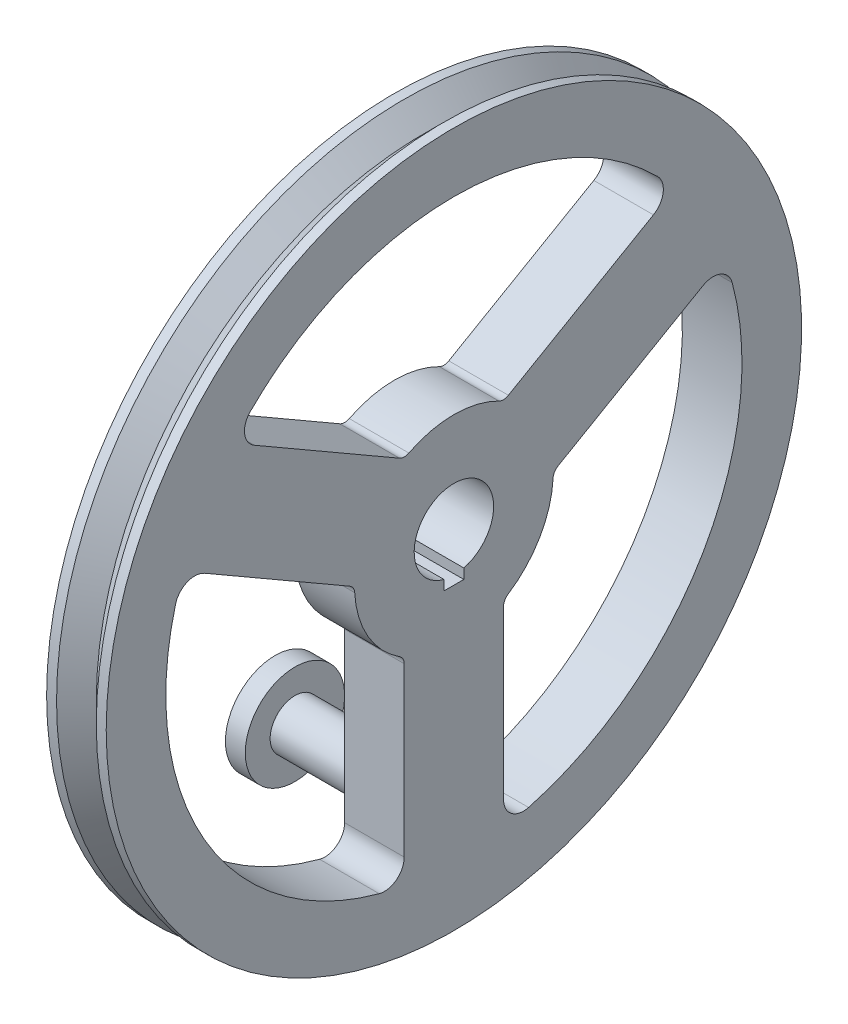
ISO-10303-21;
HEADER;
FILE_DESCRIPTION(('STEP AP214'),'2;1');
FILE_NAME('part.step','',(''),(''),'','','');
FILE_SCHEMA(('AUTOMOTIVE_DESIGN { 1 0 10303 214 1 1 1 1 }'));
ENDSEC;
DATA;
#1=APPLICATION_CONTEXT('core data for automotive mechanical design processes');
#2=APPLICATION_PROTOCOL_DEFINITION('international standard','automotive_design',2000,#1);
#3=PRODUCT_CONTEXT('',#1,'mechanical');
#4=PRODUCT('Part','Part','',(#3));
#5=PRODUCT_RELATED_PRODUCT_CATEGORY('part','',(#4));
#6=PRODUCT_DEFINITION_FORMATION('','',#4);
#7=PRODUCT_DEFINITION_CONTEXT('part definition',#1,'design');
#8=PRODUCT_DEFINITION('design','',#6,#7);
#9=PRODUCT_DEFINITION_SHAPE('','',#8);
#10=(LENGTH_UNIT() NAMED_UNIT(*) SI_UNIT(.MILLI.,.METRE.));
#11=(NAMED_UNIT(*) PLANE_ANGLE_UNIT() SI_UNIT($,.RADIAN.));
#12=(NAMED_UNIT(*) SI_UNIT($,.STERADIAN.) SOLID_ANGLE_UNIT());
#13=UNCERTAINTY_MEASURE_WITH_UNIT(LENGTH_MEASURE(1.E-05),#10,'distance_accuracy_value','');
#14=(GEOMETRIC_REPRESENTATION_CONTEXT(3) GLOBAL_UNCERTAINTY_ASSIGNED_CONTEXT((#13)) GLOBAL_UNIT_ASSIGNED_CONTEXT((#10,
#11,#12)) REPRESENTATION_CONTEXT('',''));
#15=CARTESIAN_POINT('',(0.,0.,0.));
#16=DIRECTION('',(0.,0.,1.));
#17=DIRECTION('',(1.,0.,0.));
#18=AXIS2_PLACEMENT_3D('',#15,#16,#17);
#19=CARTESIAN_POINT('',(-15.,0.,0.));
#20=DIRECTION('',(1.,0.,0.));
#21=DIRECTION('',(0.,0.,-1.));
#22=AXIS2_PLACEMENT_3D('',#19,#20,#21);
#23=PLANE('',#22);
#24=CARTESIAN_POINT('',(-15.,0.,0.));
#25=DIRECTION('',(-1.,0.,0.));
#26=DIRECTION('',(0.,0.,1.));
#27=AXIS2_PLACEMENT_3D('',#24,#25,#26);
#28=CIRCLE('',#27,175.);
#29=CARTESIAN_POINT('',(-15.,0.,175.));
#30=VERTEX_POINT('',#29);
#31=EDGE_CURVE('E453',#30,#30,#28,.T.);
#32=ORIENTED_EDGE('',*,*,#31,.T.);
#33=EDGE_LOOP('',(#32));
#34=FACE_BOUND('',#33,.T.);
#35=CARTESIAN_POINT('',(-15.,0.,0.));
#36=DIRECTION('',(-1.,0.,0.));
#37=DIRECTION('',(0.,0.,1.));
#38=AXIS2_PLACEMENT_3D('',#35,#36,#37);
#39=CIRCLE('',#38,145.);
#40=CARTESIAN_POINT('',(-15.,-140.04212574139,37.5925925925926));
#41=VERTEX_POINT('',#40);
#42=CARTESIAN_POINT('',(-15.,37.4649226913919,140.076334788315));
#43=VERTEX_POINT('',#42);
#44=EDGE_CURVE('E448',#41,#43,#39,.T.);
#45=ORIENTED_EDGE('',*,*,#44,.F.);
#46=CARTESIAN_POINT('',(-15.,-130.384048104053,35.));
#47=DIRECTION('',(1.,0.,0.));
#48=DIRECTION('',(0.,0.,-1.));
#49=AXIS2_PLACEMENT_3D('',#46,#47,#48);
#50=CIRCLE('',#49,10.);
#51=CARTESIAN_POINT('',(-15.,-130.384048104053,25.));
#52=VERTEX_POINT('',#51);
#53=EDGE_CURVE('E343',#52,#41,#50,.F.);
#54=ORIENTED_EDGE('',*,*,#53,.F.);
#55=DIRECTION('',(0.,-1.,0.));
#56=VECTOR('',#55,1.);
#57=CARTESIAN_POINT('',(-15.,0.,25.));
#58=LINE('',#57,#56);
#59=CARTESIAN_POINT('',(-15.,-46.0977222864644,25.));
#60=VERTEX_POINT('',#59);
#61=EDGE_CURVE('E341',#60,#52,#58,.T.);
#62=ORIENTED_EDGE('',*,*,#61,.F.);
#63=CARTESIAN_POINT('',(-15.,-46.0977222864644,30.));
#64=DIRECTION('',(1.,0.,0.));
#65=DIRECTION('',(0.,0.,-1.));
#66=AXIS2_PLACEMENT_3D('',#63,#64,#65);
#67=CIRCLE('',#66,5.);
#68=CARTESIAN_POINT('',(-15.,-41.9070202604222,27.2727272727273));
#69=VERTEX_POINT('',#68);
#70=EDGE_CURVE('E339',#69,#60,#67,.F.);
#71=ORIENTED_EDGE('',*,*,#70,.F.);
#72=CARTESIAN_POINT('',(-15.,0.,0.));
#73=DIRECTION('',(-1.,0.,0.));
#74=DIRECTION('',(0.,0.,1.));
#75=AXIS2_PLACEMENT_3D('',#72,#73,#74);
#76=CIRCLE('',#75,50.);
#77=CARTESIAN_POINT('',(-15.,-2.66536451845599,49.9289077787984));
#78=VERTEX_POINT('',#77);
#79=EDGE_CURVE('E370',#69,#78,#76,.T.);
#80=ORIENTED_EDGE('',*,*,#79,.T.);
#81=CARTESIAN_POINT('',(-15.,-2.93190097030164,54.9217985566787));
#82=DIRECTION('',(1.,0.,0.));
#83=DIRECTION('',(0.,0.,-1.));
#84=AXIS2_PLACEMENT_3D('',#81,#82,#83);
#85=CIRCLE('',#84,5.00000000000081);
#86=CARTESIAN_POINT('',(-15.,1.39822604862124,52.4217985566783));
#87=VERTEX_POINT('',#86);
#88=EDGE_CURVE('E406',#78,#87,#85,.T.);
#89=ORIENTED_EDGE('',*,*,#88,.T.);
#90=DIRECTION('',(0.,0.500000000000006,0.866025403784435));
#91=VECTOR('',#90,1.);
#92=CARTESIAN_POINT('',(-15.,-21.6506350946112,12.5000000000003));
#93=LINE('',#92,#91);
#94=CARTESIAN_POINT('',(-15.,43.5413889574161,125.415897906362));
#95=VERTEX_POINT('',#94);
#96=EDGE_CURVE('E403',#87,#95,#93,.T.);
#97=ORIENTED_EDGE('',*,*,#96,.T.);
#98=CARTESIAN_POINT('',(-15.,34.8811349195717,130.415897906362));
#99=DIRECTION('',(1.,0.,0.));
#100=DIRECTION('',(0.,0.,-1.));
#101=AXIS2_PLACEMENT_3D('',#98,#99,#100);
#102=CIRCLE('',#101,10.);
#103=EDGE_CURVE('E382',#95,#43,#102,.T.);
#104=ORIENTED_EDGE('',*,*,#103,.T.);
#105=EDGE_LOOP('',(#45,#54,#62,#71,#80,#89,#97,#104));
#106=FACE_BOUND('',#105,.T.);
#107=CARTESIAN_POINT('',(-15.,44.5723847788776,22.6561805060711));
#108=VERTEX_POINT('',#107);
#109=CARTESIAN_POINT('',(-15.,44.5723847788776,-22.6561805060711));
#110=VERTEX_POINT('',#109);
#111=EDGE_CURVE('E371',#108,#110,#76,.T.);
#112=ORIENTED_EDGE('',*,*,#111,.T.);
#113=CARTESIAN_POINT('',(-15.,49.0296232567654,-24.9217985566783));
#114=DIRECTION('',(1.,0.,0.));
#115=DIRECTION('',(0.,0.,-1.));
#116=AXIS2_PLACEMENT_3D('',#113,#114,#115);
#117=CIRCLE('',#116,5.);
#118=CARTESIAN_POINT('',(-15.,44.6994962378432,-27.4217985566783));
#119=VERTEX_POINT('',#118);
#120=EDGE_CURVE('E269',#110,#119,#117,.T.);
#121=ORIENTED_EDGE('',*,*,#120,.T.);
#122=DIRECTION('',(0.,0.499999999999987,-0.866025403784446));
#123=VECTOR('',#122,1.);
#124=CARTESIAN_POINT('',(-15.,21.6506350946117,12.5));
#125=LINE('',#124,#123);
#126=CARTESIAN_POINT('',(-15.,86.8426591466365,-100.415897906363));
#127=VERTEX_POINT('',#126);
#128=EDGE_CURVE('E274',#119,#127,#125,.T.);
#129=ORIENTED_EDGE('',*,*,#128,.T.);
#130=CARTESIAN_POINT('',(-15.,95.502913184481,-95.415897906363));
#131=DIRECTION('',(1.,0.,0.));
#132=DIRECTION('',(0.,0.,-1.));
#133=AXIS2_PLACEMENT_3D('',#130,#131,#132);
#134=CIRCLE('',#133,10.);
#135=CARTESIAN_POINT('',(-15.,102.577203049998,-102.483742195723));
#136=VERTEX_POINT('',#135);
#137=EDGE_CURVE('E295',#127,#136,#134,.T.);
#138=ORIENTED_EDGE('',*,*,#137,.T.);
#139=CARTESIAN_POINT('',(-15.,102.57720305,102.483742195722));
#140=VERTEX_POINT('',#139);
#141=EDGE_CURVE('E450',#140,#136,#39,.T.);
#142=ORIENTED_EDGE('',*,*,#141,.F.);
#143=CARTESIAN_POINT('',(-15.,95.5029131844823,95.4158979063617));
#144=DIRECTION('',(1.,0.,0.));
#145=DIRECTION('',(0.,0.,-1.));
#146=AXIS2_PLACEMENT_3D('',#143,#144,#145);
#147=CIRCLE('',#146,10.);
#148=CARTESIAN_POINT('',(-15.,86.8426591466379,100.415897906362));
#149=VERTEX_POINT('',#148);
#150=EDGE_CURVE('E387',#149,#140,#147,.F.);
#151=ORIENTED_EDGE('',*,*,#150,.F.);
#152=DIRECTION('',(0.,0.500000000000006,0.866025403784435));
#153=VECTOR('',#152,1.);
#154=CARTESIAN_POINT('',(-15.,21.6506350946106,-12.5));
#155=LINE('',#154,#153);
#156=CARTESIAN_POINT('',(-15.,44.6994962378432,27.4217985566783));
#157=VERTEX_POINT('',#156);
#158=EDGE_CURVE('E411',#157,#149,#155,.T.);
#159=ORIENTED_EDGE('',*,*,#158,.F.);
#160=CARTESIAN_POINT('',(-15.,49.0296232567654,24.9217985566783));
#161=DIRECTION('',(1.,0.,0.));
#162=DIRECTION('',(0.,0.,-1.));
#163=AXIS2_PLACEMENT_3D('',#160,#161,#162);
#164=CIRCLE('',#163,5.);
#165=EDGE_CURVE('E409',#108,#157,#164,.F.);
#166=ORIENTED_EDGE('',*,*,#165,.F.);
#167=EDGE_LOOP('',(#112,#121,#129,#138,#142,#151,#159,#166));
#168=FACE_BOUND('',#167,.T.);
#169=CARTESIAN_POINT('',(-15.,-2.93190097030091,-54.9217985566783));
#170=DIRECTION('',(1.,0.,0.));
#171=DIRECTION('',(0.,0.,-1.));
#172=AXIS2_PLACEMENT_3D('',#169,#170,#171);
#173=CIRCLE('',#172,5.);
#174=CARTESIAN_POINT('',(-15.,-2.66536451845537,-49.9289077787985));
#175=VERTEX_POINT('',#174);
#176=CARTESIAN_POINT('',(-15.,1.39822604862128,-52.4217985566783));
#177=VERTEX_POINT('',#176);
#178=EDGE_CURVE('E289',#175,#177,#173,.F.);
#179=ORIENTED_EDGE('',*,*,#178,.F.);
#180=CARTESIAN_POINT('',(-15.,-41.9070202604222,-27.2727272727273));
#181=VERTEX_POINT('',#180);
#182=EDGE_CURVE('E62',#175,#181,#76,.T.);
#183=ORIENTED_EDGE('',*,*,#182,.T.);
#184=CARTESIAN_POINT('',(-15.,-46.0977222864644,-30.));
#185=DIRECTION('',(1.,0.,0.));
#186=DIRECTION('',(0.,0.,-1.));
#187=AXIS2_PLACEMENT_3D('',#184,#185,#186);
#188=CIRCLE('',#187,5.);
#189=CARTESIAN_POINT('',(-15.,-46.0977222864644,-25.));
#190=VERTEX_POINT('',#189);
#191=EDGE_CURVE('E318',#181,#190,#188,.T.);
#192=ORIENTED_EDGE('',*,*,#191,.T.);
#193=DIRECTION('',(0.,-1.,0.));
#194=VECTOR('',#193,1.);
#195=CARTESIAN_POINT('',(-15.,0.,-25.));
#196=LINE('',#195,#194);
#197=CARTESIAN_POINT('',(-15.,-130.384048104053,-25.));
#198=VERTEX_POINT('',#197);
#199=EDGE_CURVE('E323',#190,#198,#196,.T.);
#200=ORIENTED_EDGE('',*,*,#199,.T.);
#201=CARTESIAN_POINT('',(-15.,-130.384048104053,-35.));
#202=DIRECTION('',(1.,0.,0.));
#203=DIRECTION('',(0.,0.,-1.));
#204=AXIS2_PLACEMENT_3D('',#201,#202,#203);
#205=CIRCLE('',#204,10.);
#206=CARTESIAN_POINT('',(-15.,-140.04212574139,-37.5925925925926));
#207=VERTEX_POINT('',#206);
#208=EDGE_CURVE('E345',#198,#207,#205,.T.);
#209=ORIENTED_EDGE('',*,*,#208,.T.);
#210=CARTESIAN_POINT('',(-15.,37.4649226913899,-140.076334788315));
#211=VERTEX_POINT('',#210);
#212=EDGE_CURVE('E454',#211,#207,#39,.T.);
#213=ORIENTED_EDGE('',*,*,#212,.F.);
#214=CARTESIAN_POINT('',(-15.,34.8811349195699,-130.415897906362));
#215=DIRECTION('',(1.,0.,0.));
#216=DIRECTION('',(0.,0.,-1.));
#217=AXIS2_PLACEMENT_3D('',#214,#215,#216);
#218=CIRCLE('',#217,10.);
#219=CARTESIAN_POINT('',(-15.,43.5413889574143,-125.415897906363));
#220=VERTEX_POINT('',#219);
#221=EDGE_CURVE('E293',#220,#211,#218,.F.);
#222=ORIENTED_EDGE('',*,*,#221,.F.);
#223=DIRECTION('',(0.,0.499999999999987,-0.866025403784446));
#224=VECTOR('',#223,1.);
#225=CARTESIAN_POINT('',(-15.,-21.6506350946105,-12.4999999999993));
#226=LINE('',#225,#224);
#227=EDGE_CURVE('E291',#177,#220,#226,.T.);
#228=ORIENTED_EDGE('',*,*,#227,.F.);
#229=EDGE_LOOP('',(#179,#183,#192,#200,#209,#213,#222,#228));
#230=FACE_BOUND('',#229,.T.);
#231=CARTESIAN_POINT('',(-15.,-125.,0.));
#232=DIRECTION('',(1.,0.,0.));
#233=DIRECTION('',(0.,0.,-1.));
#234=AXIS2_PLACEMENT_3D('',#231,#232,#233);
#235=CIRCLE('',#234,12.5);
#236=CARTESIAN_POINT('',(-15.,-125.,-12.5));
#237=VERTEX_POINT('',#236);
#238=EDGE_CURVE('E12',#237,#237,#235,.F.);
#239=ORIENTED_EDGE('',*,*,#238,.F.);
#240=EDGE_LOOP('',(#239));
#241=FACE_BOUND('',#240,.T.);
#242=DIRECTION('',(0.,-1.,0.));
#243=VECTOR('',#242,1.);
#244=CARTESIAN_POINT('',(-15.,0.,5.));
#245=LINE('',#244,#243);
#246=CARTESIAN_POINT('',(-15.,-19.3649167310371,5.));
#247=VERTEX_POINT('',#246);
#248=CARTESIAN_POINT('',(-15.,-24.3649167310371,5.));
#249=VERTEX_POINT('',#248);
#250=EDGE_CURVE('E246',#247,#249,#245,.T.);
#251=ORIENTED_EDGE('',*,*,#250,.T.);
#252=DIRECTION('',(0.,0.,-1.));
#253=VECTOR('',#252,1.);
#254=CARTESIAN_POINT('',(-15.,-24.3649167310371,0.));
#255=LINE('',#254,#253);
#256=CARTESIAN_POINT('',(-15.,-24.3649167310371,-5.));
#257=VERTEX_POINT('',#256);
#258=EDGE_CURVE('E249',#249,#257,#255,.T.);
#259=ORIENTED_EDGE('',*,*,#258,.T.);
#260=DIRECTION('',(0.,-1.,0.));
#261=VECTOR('',#260,1.);
#262=CARTESIAN_POINT('',(-15.,0.,-5.));
#263=LINE('',#262,#261);
#264=CARTESIAN_POINT('',(-15.,-19.3649167310371,-5.));
#265=VERTEX_POINT('',#264);
#266=EDGE_CURVE('E238',#265,#257,#263,.T.);
#267=ORIENTED_EDGE('',*,*,#266,.F.);
#268=CARTESIAN_POINT('',(-15.,0.,0.));
#269=DIRECTION('',(-1.,0.,0.));
#270=DIRECTION('',(0.,0.,1.));
#271=AXIS2_PLACEMENT_3D('',#268,#269,#270);
#272=CIRCLE('',#271,20.);
#273=EDGE_CURVE('E379',#247,#265,#272,.T.);
#274=ORIENTED_EDGE('',*,*,#273,.F.);
#275=EDGE_LOOP('',(#251,#259,#267,#274));
#276=FACE_BOUND('',#275,.T.);
#277=ADVANCED_FACE('F39',(#34,#106,#168,#230,#241,#276),#23,.F.);
#278=CARTESIAN_POINT('',(15.,0.,0.));
#279=DIRECTION('',(-1.,0.,0.));
#280=DIRECTION('',(0.,0.,1.));
#281=AXIS2_PLACEMENT_3D('',#278,#279,#280);
#282=PLANE('',#281);
#283=CARTESIAN_POINT('',(15.,-130.384048104053,35.));
#284=DIRECTION('',(1.,0.,0.));
#285=DIRECTION('',(0.,0.,-1.));
#286=AXIS2_PLACEMENT_3D('',#283,#284,#285);
#287=CIRCLE('',#286,10.);
#288=CARTESIAN_POINT('',(15.,-130.384048104053,25.));
#289=VERTEX_POINT('',#288);
#290=CARTESIAN_POINT('',(15.,-140.04212574139,37.5925925925926));
#291=VERTEX_POINT('',#290);
#292=EDGE_CURVE('E327',#289,#291,#287,.F.);
#293=ORIENTED_EDGE('',*,*,#292,.T.);
#294=CARTESIAN_POINT('',(15.,0.,0.));
#295=DIRECTION('',(-1.,0.,0.));
#296=DIRECTION('',(0.,0.,1.));
#297=AXIS2_PLACEMENT_3D('',#294,#295,#296);
#298=CIRCLE('',#297,145.);
#299=CARTESIAN_POINT('',(15.,37.4649226913919,140.076334788315));
#300=VERTEX_POINT('',#299);
#301=EDGE_CURVE('E444',#291,#300,#298,.T.);
#302=ORIENTED_EDGE('',*,*,#301,.T.);
#303=CARTESIAN_POINT('',(15.,34.8811349195717,130.415897906362));
#304=DIRECTION('',(1.,0.,0.));
#305=DIRECTION('',(0.,0.,-1.));
#306=AXIS2_PLACEMENT_3D('',#303,#304,#305);
#307=CIRCLE('',#306,10.);
#308=CARTESIAN_POINT('',(15.,43.5413889574161,125.415897906362));
#309=VERTEX_POINT('',#308);
#310=EDGE_CURVE('E383',#309,#300,#307,.T.);
#311=ORIENTED_EDGE('',*,*,#310,.F.);
#312=DIRECTION('',(0.,0.500000000000006,0.866025403784435));
#313=VECTOR('',#312,1.);
#314=CARTESIAN_POINT('',(15.,-21.6506350946112,12.5000000000003));
#315=LINE('',#314,#313);
#316=CARTESIAN_POINT('',(15.,1.39822604862124,52.4217985566783));
#317=VERTEX_POINT('',#316);
#318=EDGE_CURVE('E386',#317,#309,#315,.T.);
#319=ORIENTED_EDGE('',*,*,#318,.F.);
#320=CARTESIAN_POINT('',(15.,-2.93190097030164,54.9217985566787));
#321=DIRECTION('',(1.,0.,0.));
#322=DIRECTION('',(0.,0.,-1.));
#323=AXIS2_PLACEMENT_3D('',#320,#321,#322);
#324=CIRCLE('',#323,5.00000000000081);
#325=CARTESIAN_POINT('',(15.,-2.66536451845599,49.9289077787984));
#326=VERTEX_POINT('',#325);
#327=EDGE_CURVE('E390',#326,#317,#324,.T.);
#328=ORIENTED_EDGE('',*,*,#327,.F.);
#329=CARTESIAN_POINT('',(15.,0.,0.));
#330=DIRECTION('',(-1.,0.,0.));
#331=DIRECTION('',(0.,0.,1.));
#332=AXIS2_PLACEMENT_3D('',#329,#330,#331);
#333=CIRCLE('',#332,50.);
#334=CARTESIAN_POINT('',(15.,-41.9070202604222,27.2727272727273));
#335=VERTEX_POINT('',#334);
#336=EDGE_CURVE('E374',#335,#326,#333,.T.);
#337=ORIENTED_EDGE('',*,*,#336,.F.);
#338=CARTESIAN_POINT('',(15.,-46.0977222864644,30.));
#339=DIRECTION('',(1.,0.,0.));
#340=DIRECTION('',(0.,0.,-1.));
#341=AXIS2_PLACEMENT_3D('',#338,#339,#340);
#342=CIRCLE('',#341,5.);
#343=CARTESIAN_POINT('',(15.,-46.0977222864644,25.));
#344=VERTEX_POINT('',#343);
#345=EDGE_CURVE('E322',#335,#344,#342,.F.);
#346=ORIENTED_EDGE('',*,*,#345,.T.);
#347=DIRECTION('',(0.,-1.,0.));
#348=VECTOR('',#347,1.);
#349=CARTESIAN_POINT('',(15.,0.,25.));
#350=LINE('',#349,#348);
#351=EDGE_CURVE('E325',#344,#289,#350,.T.);
#352=ORIENTED_EDGE('',*,*,#351,.T.);
#353=EDGE_LOOP('',(#293,#302,#311,#319,#328,#337,#346,#352));
#354=FACE_BOUND('',#353,.T.);
#355=CARTESIAN_POINT('',(15.,0.,0.));
#356=DIRECTION('',(-1.,0.,0.));
#357=DIRECTION('',(0.,0.,1.));
#358=AXIS2_PLACEMENT_3D('',#355,#356,#357);
#359=CIRCLE('',#358,175.);
#360=CARTESIAN_POINT('',(15.,0.,175.));
#361=VERTEX_POINT('',#360);
#362=EDGE_CURVE('E441',#361,#361,#359,.T.);
#363=ORIENTED_EDGE('',*,*,#362,.F.);
#364=EDGE_LOOP('',(#363));
#365=FACE_BOUND('',#364,.T.);
#366=CARTESIAN_POINT('',(15.,102.57720305,102.483742195722));
#367=VERTEX_POINT('',#366);
#368=CARTESIAN_POINT('',(15.,102.577203049998,-102.483742195723));
#369=VERTEX_POINT('',#368);
#370=EDGE_CURVE('E445',#367,#369,#298,.T.);
#371=ORIENTED_EDGE('',*,*,#370,.T.);
#372=CARTESIAN_POINT('',(15.,95.502913184481,-95.415897906363));
#373=DIRECTION('',(1.,0.,0.));
#374=DIRECTION('',(0.,0.,-1.));
#375=AXIS2_PLACEMENT_3D('',#372,#373,#374);
#376=CIRCLE('',#375,10.);
#377=CARTESIAN_POINT('',(15.,86.8426591466365,-100.415897906363));
#378=VERTEX_POINT('',#377);
#379=EDGE_CURVE('E281',#378,#369,#376,.T.);
#380=ORIENTED_EDGE('',*,*,#379,.F.);
#381=DIRECTION('',(0.,0.499999999999987,-0.866025403784446));
#382=VECTOR('',#381,1.);
#383=CARTESIAN_POINT('',(15.,21.6506350946117,12.5));
#384=LINE('',#383,#382);
#385=CARTESIAN_POINT('',(15.,44.6994962378432,-27.4217985566783));
#386=VERTEX_POINT('',#385);
#387=EDGE_CURVE('E283',#386,#378,#384,.T.);
#388=ORIENTED_EDGE('',*,*,#387,.F.);
#389=CARTESIAN_POINT('',(15.,49.0296232567654,-24.9217985566783));
#390=DIRECTION('',(1.,0.,0.));
#391=DIRECTION('',(0.,0.,-1.));
#392=AXIS2_PLACEMENT_3D('',#389,#390,#391);
#393=CIRCLE('',#392,5.);
#394=CARTESIAN_POINT('',(15.,44.5723847788776,-22.6561805060711));
#395=VERTEX_POINT('',#394);
#396=EDGE_CURVE('E270',#395,#386,#393,.T.);
#397=ORIENTED_EDGE('',*,*,#396,.F.);
#398=CARTESIAN_POINT('',(15.,44.5723847788776,22.6561805060712));
#399=VERTEX_POINT('',#398);
#400=EDGE_CURVE('E375',#399,#395,#333,.T.);
#401=ORIENTED_EDGE('',*,*,#400,.F.);
#402=CARTESIAN_POINT('',(15.,49.0296232567654,24.9217985566783));
#403=DIRECTION('',(1.,0.,0.));
#404=DIRECTION('',(0.,0.,-1.));
#405=AXIS2_PLACEMENT_3D('',#402,#403,#404);
#406=CIRCLE('',#405,5.);
#407=CARTESIAN_POINT('',(15.,44.6994962378432,27.4217985566783));
#408=VERTEX_POINT('',#407);
#409=EDGE_CURVE('E393',#399,#408,#406,.F.);
#410=ORIENTED_EDGE('',*,*,#409,.T.);
#411=DIRECTION('',(0.,0.500000000000006,0.866025403784435));
#412=VECTOR('',#411,1.);
#413=CARTESIAN_POINT('',(15.,21.6506350946106,-12.5));
#414=LINE('',#413,#412);
#415=CARTESIAN_POINT('',(15.,86.8426591466379,100.415897906362));
#416=VERTEX_POINT('',#415);
#417=EDGE_CURVE('E395',#408,#416,#414,.T.);
#418=ORIENTED_EDGE('',*,*,#417,.T.);
#419=CARTESIAN_POINT('',(15.,95.5029131844823,95.4158979063617));
#420=DIRECTION('',(1.,0.,0.));
#421=DIRECTION('',(0.,0.,-1.));
#422=AXIS2_PLACEMENT_3D('',#419,#420,#421);
#423=CIRCLE('',#422,10.);
#424=EDGE_CURVE('E397',#416,#367,#423,.F.);
#425=ORIENTED_EDGE('',*,*,#424,.T.);
#426=EDGE_LOOP('',(#371,#380,#388,#397,#401,#410,#418,#425));
#427=FACE_BOUND('',#426,.T.);
#428=CARTESIAN_POINT('',(15.,-2.66536451845538,-49.9289077787985));
#429=VERTEX_POINT('',#428);
#430=CARTESIAN_POINT('',(15.,-41.9070202604222,-27.2727272727273));
#431=VERTEX_POINT('',#430);
#432=EDGE_CURVE('E377',#429,#431,#333,.T.);
#433=ORIENTED_EDGE('',*,*,#432,.F.);
#434=CARTESIAN_POINT('',(15.,-2.93190097030091,-54.9217985566783));
#435=DIRECTION('',(1.,0.,0.));
#436=DIRECTION('',(0.,0.,-1.));
#437=AXIS2_PLACEMENT_3D('',#434,#435,#436);
#438=CIRCLE('',#437,5.);
#439=CARTESIAN_POINT('',(15.,1.39822604862128,-52.4217985566783));
#440=VERTEX_POINT('',#439);
#441=EDGE_CURVE('E273',#429,#440,#438,.F.);
#442=ORIENTED_EDGE('',*,*,#441,.T.);
#443=DIRECTION('',(0.,0.499999999999987,-0.866025403784446));
#444=VECTOR('',#443,1.);
#445=CARTESIAN_POINT('',(15.,-21.6506350946105,-12.4999999999993));
#446=LINE('',#445,#444);
#447=CARTESIAN_POINT('',(15.,43.5413889574143,-125.415897906363));
#448=VERTEX_POINT('',#447);
#449=EDGE_CURVE('E276',#440,#448,#446,.T.);
#450=ORIENTED_EDGE('',*,*,#449,.T.);
#451=CARTESIAN_POINT('',(15.,34.8811349195699,-130.415897906362));
#452=DIRECTION('',(1.,0.,0.));
#453=DIRECTION('',(0.,0.,-1.));
#454=AXIS2_PLACEMENT_3D('',#451,#452,#453);
#455=CIRCLE('',#454,10.);
#456=CARTESIAN_POINT('',(15.,37.4649226913899,-140.076334788315));
#457=VERTEX_POINT('',#456);
#458=EDGE_CURVE('E278',#448,#457,#455,.F.);
#459=ORIENTED_EDGE('',*,*,#458,.T.);
#460=CARTESIAN_POINT('',(15.,-140.04212574139,-37.5925925925926));
#461=VERTEX_POINT('',#460);
#462=EDGE_CURVE('E449',#457,#461,#298,.T.);
#463=ORIENTED_EDGE('',*,*,#462,.T.);
#464=CARTESIAN_POINT('',(15.,-130.384048104053,-35.));
#465=DIRECTION('',(1.,0.,0.));
#466=DIRECTION('',(0.,0.,-1.));
#467=AXIS2_PLACEMENT_3D('',#464,#465,#466);
#468=CIRCLE('',#467,10.);
#469=CARTESIAN_POINT('',(15.,-130.384048104053,-25.));
#470=VERTEX_POINT('',#469);
#471=EDGE_CURVE('E330',#470,#461,#468,.T.);
#472=ORIENTED_EDGE('',*,*,#471,.F.);
#473=DIRECTION('',(0.,-1.,0.));
#474=VECTOR('',#473,1.);
#475=CARTESIAN_POINT('',(15.,0.,-25.));
#476=LINE('',#475,#474);
#477=CARTESIAN_POINT('',(15.,-46.0977222864644,-25.));
#478=VERTEX_POINT('',#477);
#479=EDGE_CURVE('E333',#478,#470,#476,.T.);
#480=ORIENTED_EDGE('',*,*,#479,.F.);
#481=CARTESIAN_POINT('',(15.,-46.0977222864644,-30.));
#482=DIRECTION('',(1.,0.,0.));
#483=DIRECTION('',(0.,0.,-1.));
#484=AXIS2_PLACEMENT_3D('',#481,#482,#483);
#485=CIRCLE('',#484,5.);
#486=EDGE_CURVE('E319',#431,#478,#485,.T.);
#487=ORIENTED_EDGE('',*,*,#486,.F.);
#488=EDGE_LOOP('',(#433,#442,#450,#459,#463,#472,#480,#487));
#489=FACE_BOUND('',#488,.T.);
#490=DIRECTION('',(0.,-1.,0.));
#491=VECTOR('',#490,1.);
#492=CARTESIAN_POINT('',(15.,0.,5.));
#493=LINE('',#492,#491);
#494=CARTESIAN_POINT('',(15.,-19.3649167310371,5.));
#495=VERTEX_POINT('',#494);
#496=CARTESIAN_POINT('',(15.,-24.3649167310371,5.));
#497=VERTEX_POINT('',#496);
#498=EDGE_CURVE('E234',#495,#497,#493,.T.);
#499=ORIENTED_EDGE('',*,*,#498,.F.);
#500=CARTESIAN_POINT('',(15.,0.,0.));
#501=DIRECTION('',(-1.,0.,0.));
#502=DIRECTION('',(0.,0.,1.));
#503=AXIS2_PLACEMENT_3D('',#500,#501,#502);
#504=CIRCLE('',#503,20.);
#505=CARTESIAN_POINT('',(15.,-19.3649167310371,-5.));
#506=VERTEX_POINT('',#505);
#507=EDGE_CURVE('E245',#495,#506,#504,.T.);
#508=ORIENTED_EDGE('',*,*,#507,.T.);
#509=DIRECTION('',(0.,-1.,0.));
#510=VECTOR('',#509,1.);
#511=CARTESIAN_POINT('',(15.,0.,-5.));
#512=LINE('',#511,#510);
#513=CARTESIAN_POINT('',(15.,-24.3649167310371,-5.));
#514=VERTEX_POINT('',#513);
#515=EDGE_CURVE('E54',#506,#514,#512,.T.);
#516=ORIENTED_EDGE('',*,*,#515,.T.);
#517=DIRECTION('',(0.,0.,-1.));
#518=VECTOR('',#517,1.);
#519=CARTESIAN_POINT('',(15.,-24.3649167310371,0.));
#520=LINE('',#519,#518);
#521=EDGE_CURVE('E226',#497,#514,#520,.T.);
#522=ORIENTED_EDGE('',*,*,#521,.F.);
#523=EDGE_LOOP('',(#499,#508,#516,#522));
#524=FACE_BOUND('',#523,.T.);
#525=ADVANCED_FACE('F243',(#354,#365,#427,#489,#524),#282,.F.);
#526=CARTESIAN_POINT('',(0.,0.,0.));
#527=DIRECTION('',(-1.,0.,0.));
#528=DIRECTION('',(0.,0.,1.));
#529=AXIS2_PLACEMENT_3D('',#526,#527,#528);
#530=CYLINDRICAL_SURFACE('',#529,20.);
#531=DIRECTION('',(-1.,0.,0.));
#532=VECTOR('',#531,1.);
#533=CARTESIAN_POINT('',(15.,-19.3649167310371,5.));
#534=LINE('',#533,#532);
#535=EDGE_CURVE('E255',#495,#247,#534,.T.);
#536=ORIENTED_EDGE('',*,*,#535,.T.);
#537=ORIENTED_EDGE('',*,*,#273,.T.);
#538=DIRECTION('',(-1.,0.,0.));
#539=VECTOR('',#538,1.);
#540=CARTESIAN_POINT('',(15.,-19.3649167310371,-5.));
#541=LINE('',#540,#539);
#542=EDGE_CURVE('E240',#506,#265,#541,.T.);
#543=ORIENTED_EDGE('',*,*,#542,.F.);
#544=ORIENTED_EDGE('',*,*,#507,.F.);
#545=EDGE_LOOP('',(#536,#537,#543,#544));
#546=FACE_BOUND('',#545,.T.);
#547=ADVANCED_FACE('F481',(#546),#530,.F.);
#548=CARTESIAN_POINT('',(0.,0.,0.));
#549=DIRECTION('',(-1.,0.,0.));
#550=DIRECTION('',(0.,0.,1.));
#551=AXIS2_PLACEMENT_3D('',#548,#549,#550);
#552=CYLINDRICAL_SURFACE('',#551,145.);
#553=DIRECTION('',(-1.,0.,0.));
#554=VECTOR('',#553,1.);
#555=CARTESIAN_POINT('',(15.,102.577203049998,-102.483742195723));
#556=LINE('',#555,#554);
#557=EDGE_CURVE('E303',#369,#136,#556,.T.);
#558=ORIENTED_EDGE('',*,*,#557,.F.);
#559=ORIENTED_EDGE('',*,*,#370,.F.);
#560=DIRECTION('',(-1.,0.,0.));
#561=VECTOR('',#560,1.);
#562=CARTESIAN_POINT('',(15.,102.57720305,102.483742195722));
#563=LINE('',#562,#561);
#564=EDGE_CURVE('E400',#367,#140,#563,.T.);
#565=ORIENTED_EDGE('',*,*,#564,.T.);
#566=ORIENTED_EDGE('',*,*,#141,.T.);
#567=EDGE_LOOP('',(#558,#559,#565,#566));
#568=FACE_BOUND('',#567,.T.);
#569=ADVANCED_FACE('F801',(#568),#552,.F.);
#570=CARTESIAN_POINT('',(0.,0.,0.));
#571=DIRECTION('',(-1.,0.,0.));
#572=DIRECTION('',(0.,0.,1.));
#573=AXIS2_PLACEMENT_3D('',#570,#571,#572);
#574=CYLINDRICAL_SURFACE('',#573,50.);
#575=ORIENTED_EDGE('',*,*,#400,.T.);
#576=DIRECTION('',(-1.,0.,0.));
#577=VECTOR('',#576,1.);
#578=CARTESIAN_POINT('',(15.,44.5723847788776,-22.6561805060711));
#579=LINE('',#578,#577);
#580=EDGE_CURVE('E316',#395,#110,#579,.T.);
#581=ORIENTED_EDGE('',*,*,#580,.T.);
#582=ORIENTED_EDGE('',*,*,#111,.F.);
#583=DIRECTION('',(-1.,0.,0.));
#584=VECTOR('',#583,1.);
#585=CARTESIAN_POINT('',(15.,44.5723847788776,22.6561805060711));
#586=LINE('',#585,#584);
#587=EDGE_CURVE('E422',#399,#108,#586,.T.);
#588=ORIENTED_EDGE('',*,*,#587,.F.);
#589=EDGE_LOOP('',(#575,#581,#582,#588));
#590=FACE_BOUND('',#589,.T.);
#591=ADVANCED_FACE('F546',(#590),#574,.T.);
#592=ORIENTED_EDGE('',*,*,#462,.F.);
#593=DIRECTION('',(-1.,0.,0.));
#594=VECTOR('',#593,1.);
#595=CARTESIAN_POINT('',(15.,37.4649226913899,-140.076334788315));
#596=LINE('',#595,#594);
#597=EDGE_CURVE('E305',#457,#211,#596,.T.);
#598=ORIENTED_EDGE('',*,*,#597,.T.);
#599=ORIENTED_EDGE('',*,*,#212,.T.);
#600=DIRECTION('',(-1.,0.,0.));
#601=VECTOR('',#600,1.);
#602=CARTESIAN_POINT('',(15.,-140.04212574139,-37.5925925925926));
#603=LINE('',#602,#601);
#604=EDGE_CURVE('E353',#461,#207,#603,.T.);
#605=ORIENTED_EDGE('',*,*,#604,.F.);
#606=EDGE_LOOP('',(#592,#598,#599,#605));
#607=FACE_BOUND('',#606,.T.);
#608=ADVANCED_FACE('F507',(#607),#552,.F.);
#609=DIRECTION('',(-1.,0.,0.));
#610=VECTOR('',#609,1.);
#611=CARTESIAN_POINT('',(15.,-2.66536451845538,-49.9289077787985));
#612=LINE('',#611,#610);
#613=EDGE_CURVE('E314',#429,#175,#612,.T.);
#614=ORIENTED_EDGE('',*,*,#613,.F.);
#615=ORIENTED_EDGE('',*,*,#432,.T.);
#616=DIRECTION('',(-1.,0.,0.));
#617=VECTOR('',#616,1.);
#618=CARTESIAN_POINT('',(15.,-41.9070202604222,-27.2727272727273));
#619=LINE('',#618,#617);
#620=EDGE_CURVE('E368',#431,#181,#619,.T.);
#621=ORIENTED_EDGE('',*,*,#620,.T.);
#622=ORIENTED_EDGE('',*,*,#182,.F.);
#623=EDGE_LOOP('',(#614,#615,#621,#622));
#624=FACE_BOUND('',#623,.T.);
#625=ADVANCED_FACE('F492',(#624),#574,.T.);
#626=ORIENTED_EDGE('',*,*,#301,.F.);
#627=DIRECTION('',(-1.,0.,0.));
#628=VECTOR('',#627,1.);
#629=CARTESIAN_POINT('',(15.,-140.04212574139,37.5925925925926));
#630=LINE('',#629,#628);
#631=EDGE_CURVE('E356',#291,#41,#630,.T.);
#632=ORIENTED_EDGE('',*,*,#631,.T.);
#633=ORIENTED_EDGE('',*,*,#44,.T.);
#634=DIRECTION('',(-1.,0.,0.));
#635=VECTOR('',#634,1.);
#636=CARTESIAN_POINT('',(15.,37.4649226913919,140.076334788315));
#637=LINE('',#636,#635);
#638=EDGE_CURVE('E432',#300,#43,#637,.T.);
#639=ORIENTED_EDGE('',*,*,#638,.F.);
#640=EDGE_LOOP('',(#626,#632,#633,#639));
#641=FACE_BOUND('',#640,.T.);
#642=ADVANCED_FACE('F463',(#641),#552,.F.);
#643=CARTESIAN_POINT('',(0.,0.,0.));
#644=DIRECTION('',(-1.,0.,0.));
#645=DIRECTION('',(0.,0.,1.));
#646=AXIS2_PLACEMENT_3D('',#643,#644,#645);
#647=CONICAL_SURFACE('',#646,165.,0.785398163397446);
#648=CARTESIAN_POINT('',(-9.99999999999999,0.,0.));
#649=DIRECTION('',(-1.,0.,0.));
#650=DIRECTION('',(0.,0.,1.));
#651=AXIS2_PLACEMENT_3D('',#648,#649,#650);
#652=CIRCLE('',#651,175.);
#653=CARTESIAN_POINT('',(-9.99999999999999,0.,175.));
#654=VERTEX_POINT('',#653);
#655=EDGE_CURVE('E47',#654,#654,#652,.T.);
#656=ORIENTED_EDGE('',*,*,#655,.F.);
#657=EDGE_LOOP('',(#656));
#658=FACE_BOUND('',#657,.T.);
#659=CARTESIAN_POINT('',(0.,0.,0.));
#660=DIRECTION('',(-1.,0.,0.));
#661=DIRECTION('',(0.,0.,1.));
#662=AXIS2_PLACEMENT_3D('',#659,#660,#661);
#663=CIRCLE('',#662,165.);
#664=CARTESIAN_POINT('',(0.,0.,165.));
#665=VERTEX_POINT('',#664);
#666=EDGE_CURVE('E435',#665,#665,#663,.T.);
#667=ORIENTED_EDGE('',*,*,#666,.T.);
#668=EDGE_LOOP('',(#667));
#669=FACE_BOUND('',#668,.T.);
#670=ADVANCED_FACE('F41',(#658,#669),#647,.T.);
#671=CARTESIAN_POINT('',(0.,0.,0.));
#672=DIRECTION('',(-1.,0.,0.));
#673=DIRECTION('',(0.,0.,1.));
#674=AXIS2_PLACEMENT_3D('',#671,#672,#673);
#675=CYLINDRICAL_SURFACE('',#674,175.);
#676=ORIENTED_EDGE('',*,*,#31,.F.);
#677=EDGE_LOOP('',(#676));
#678=FACE_BOUND('',#677,.T.);
#679=ORIENTED_EDGE('',*,*,#655,.T.);
#680=EDGE_LOOP('',(#679));
#681=FACE_BOUND('',#680,.T.);
#682=ADVANCED_FACE('F459',(#678,#681),#675,.T.);
#683=CARTESIAN_POINT('',(0.,0.,0.));
#684=DIRECTION('',(-1.,0.,0.));
#685=DIRECTION('',(0.,0.,1.));
#686=AXIS2_PLACEMENT_3D('',#683,#684,#685);
#687=CYLINDRICAL_SURFACE('',#686,175.);
#688=CARTESIAN_POINT('',(10.,0.,0.));
#689=DIRECTION('',(-1.,0.,0.));
#690=DIRECTION('',(0.,0.,1.));
#691=AXIS2_PLACEMENT_3D('',#688,#689,#690);
#692=CIRCLE('',#691,175.);
#693=CARTESIAN_POINT('',(10.,0.,175.));
#694=VERTEX_POINT('',#693);
#695=EDGE_CURVE('E438',#694,#694,#692,.T.);
#696=ORIENTED_EDGE('',*,*,#695,.F.);
#697=EDGE_LOOP('',(#696));
#698=FACE_BOUND('',#697,.T.);
#699=ORIENTED_EDGE('',*,*,#362,.T.);
#700=EDGE_LOOP('',(#699));
#701=FACE_BOUND('',#700,.T.);
#702=ADVANCED_FACE('F470',(#698,#701),#687,.T.);
#703=CARTESIAN_POINT('',(10.,0.,0.));
#704=DIRECTION('',(1.,0.,0.));
#705=DIRECTION('',(0.,0.,-1.));
#706=AXIS2_PLACEMENT_3D('',#703,#704,#705);
#707=CONICAL_SURFACE('',#706,175.,0.78539816339745);
#708=ORIENTED_EDGE('',*,*,#666,.F.);
#709=EDGE_LOOP('',(#708));
#710=FACE_BOUND('',#709,.T.);
#711=ORIENTED_EDGE('',*,*,#695,.T.);
#712=EDGE_LOOP('',(#711));
#713=FACE_BOUND('',#712,.T.);
#714=ADVANCED_FACE('F466',(#710,#713),#707,.T.);
#715=CARTESIAN_POINT('',(15.,34.8811349195717,130.415897906362));
#716=DIRECTION('',(-1.,0.,0.));
#717=DIRECTION('',(0.,0.,1.));
#718=AXIS2_PLACEMENT_3D('',#715,#716,#717);
#719=CYLINDRICAL_SURFACE('',#718,10.);
#720=ORIENTED_EDGE('',*,*,#103,.F.);
#721=DIRECTION('',(-1.,0.,0.));
#722=VECTOR('',#721,1.);
#723=CARTESIAN_POINT('',(15.,43.5413889574161,125.415897906362));
#724=LINE('',#723,#722);
#725=EDGE_CURVE('E430',#309,#95,#724,.T.);
#726=ORIENTED_EDGE('',*,*,#725,.F.);
#727=ORIENTED_EDGE('',*,*,#310,.T.);
#728=ORIENTED_EDGE('',*,*,#638,.T.);
#729=EDGE_LOOP('',(#720,#726,#727,#728));
#730=FACE_BOUND('',#729,.T.);
#731=ADVANCED_FACE('F469',(#730),#719,.F.);
#732=CARTESIAN_POINT('',(15.,-21.6506350946112,12.5000000000003));
#733=DIRECTION('',(0.,-0.866025403784435,0.500000000000006));
#734=DIRECTION('',(0.,-0.500000000000006,-0.866025403784435));
#735=AXIS2_PLACEMENT_3D('',#732,#733,#734);
#736=PLANE('',#735);
#737=ORIENTED_EDGE('',*,*,#96,.F.);
#738=DIRECTION('',(-1.,0.,0.));
#739=VECTOR('',#738,1.);
#740=CARTESIAN_POINT('',(15.,1.39822604862124,52.4217985566783));
#741=LINE('',#740,#739);
#742=EDGE_CURVE('E428',#317,#87,#741,.T.);
#743=ORIENTED_EDGE('',*,*,#742,.F.);
#744=ORIENTED_EDGE('',*,*,#318,.T.);
#745=ORIENTED_EDGE('',*,*,#725,.T.);
#746=EDGE_LOOP('',(#737,#743,#744,#745));
#747=FACE_BOUND('',#746,.T.);
#748=ADVANCED_FACE('F576',(#747),#736,.T.);
#749=CARTESIAN_POINT('',(15.,-2.93190097030164,54.9217985566787));
#750=DIRECTION('',(-1.,0.,0.));
#751=DIRECTION('',(0.,0.,1.));
#752=AXIS2_PLACEMENT_3D('',#749,#750,#751);
#753=CYLINDRICAL_SURFACE('',#752,5.00000000000081);
#754=ORIENTED_EDGE('',*,*,#88,.F.);
#755=DIRECTION('',(-1.,0.,0.));
#756=VECTOR('',#755,1.);
#757=CARTESIAN_POINT('',(15.,-2.66536451845597,49.9289077787981));
#758=LINE('',#757,#756);
#759=EDGE_CURVE('E425',#326,#78,#758,.T.);
#760=ORIENTED_EDGE('',*,*,#759,.F.);
#761=ORIENTED_EDGE('',*,*,#327,.T.);
#762=ORIENTED_EDGE('',*,*,#742,.T.);
#763=EDGE_LOOP('',(#754,#760,#761,#762));
#764=FACE_BOUND('',#763,.T.);
#765=ADVANCED_FACE('F584',(#764),#753,.F.);
#766=CARTESIAN_POINT('',(15.,49.0296232567654,24.9217985566783));
#767=DIRECTION('',(-1.,0.,0.));
#768=DIRECTION('',(0.,0.,1.));
#769=AXIS2_PLACEMENT_3D('',#766,#767,#768);
#770=CYLINDRICAL_SURFACE('',#769,5.);
#771=ORIENTED_EDGE('',*,*,#165,.T.);
#772=DIRECTION('',(-1.,0.,0.));
#773=VECTOR('',#772,1.);
#774=CARTESIAN_POINT('',(15.,44.6994962378432,27.4217985566783));
#775=LINE('',#774,#773);
#776=EDGE_CURVE('E419',#408,#157,#775,.T.);
#777=ORIENTED_EDGE('',*,*,#776,.F.);
#778=ORIENTED_EDGE('',*,*,#409,.F.);
#779=ORIENTED_EDGE('',*,*,#587,.T.);
#780=EDGE_LOOP('',(#771,#777,#778,#779));
#781=FACE_BOUND('',#780,.T.);
#782=ADVANCED_FACE('F592',(#781),#770,.F.);
#783=CARTESIAN_POINT('',(15.,21.6506350946106,-12.5));
#784=DIRECTION('',(0.,-0.866025403784435,0.500000000000006));
#785=DIRECTION('',(0.,-0.500000000000006,-0.866025403784435));
#786=AXIS2_PLACEMENT_3D('',#783,#784,#785);
#787=PLANE('',#786);
#788=ORIENTED_EDGE('',*,*,#158,.T.);
#789=DIRECTION('',(-1.,0.,0.));
#790=VECTOR('',#789,1.);
#791=CARTESIAN_POINT('',(15.,86.8426591466379,100.415897906362));
#792=LINE('',#791,#790);
#793=EDGE_CURVE('E416',#416,#149,#792,.T.);
#794=ORIENTED_EDGE('',*,*,#793,.F.);
#795=ORIENTED_EDGE('',*,*,#417,.F.);
#796=ORIENTED_EDGE('',*,*,#776,.T.);
#797=EDGE_LOOP('',(#788,#794,#795,#796));
#798=FACE_BOUND('',#797,.T.);
#799=ADVANCED_FACE('F600',(#798),#787,.F.);
#800=CARTESIAN_POINT('',(15.,95.5029131844823,95.4158979063617));
#801=DIRECTION('',(-1.,0.,0.));
#802=DIRECTION('',(0.,0.,1.));
#803=AXIS2_PLACEMENT_3D('',#800,#801,#802);
#804=CYLINDRICAL_SURFACE('',#803,10.);
#805=ORIENTED_EDGE('',*,*,#150,.T.);
#806=ORIENTED_EDGE('',*,*,#564,.F.);
#807=ORIENTED_EDGE('',*,*,#424,.F.);
#808=ORIENTED_EDGE('',*,*,#793,.T.);
#809=EDGE_LOOP('',(#805,#806,#807,#808));
#810=FACE_BOUND('',#809,.T.);
#811=ADVANCED_FACE('F543',(#810),#804,.F.);
#812=DIRECTION('',(-1.,0.,0.));
#813=VECTOR('',#812,1.);
#814=CARTESIAN_POINT('',(15.,-41.9070202604222,27.2727272727273));
#815=LINE('',#814,#813);
#816=EDGE_CURVE('E365',#335,#69,#815,.T.);
#817=ORIENTED_EDGE('',*,*,#816,.F.);
#818=ORIENTED_EDGE('',*,*,#336,.T.);
#819=ORIENTED_EDGE('',*,*,#759,.T.);
#820=ORIENTED_EDGE('',*,*,#79,.F.);
#821=EDGE_LOOP('',(#817,#818,#819,#820));
#822=FACE_BOUND('',#821,.T.);
#823=ADVANCED_FACE('F534',(#822),#574,.T.);
#824=CARTESIAN_POINT('',(15.,-46.0977222864644,-30.));
#825=DIRECTION('',(-1.,0.,0.));
#826=DIRECTION('',(0.,0.,1.));
#827=AXIS2_PLACEMENT_3D('',#824,#825,#826);
#828=CYLINDRICAL_SURFACE('',#827,5.);
#829=ORIENTED_EDGE('',*,*,#191,.F.);
#830=ORIENTED_EDGE('',*,*,#620,.F.);
#831=ORIENTED_EDGE('',*,*,#486,.T.);
#832=DIRECTION('',(-1.,0.,0.));
#833=VECTOR('',#832,1.);
#834=CARTESIAN_POINT('',(15.,-46.0977222864644,-25.));
#835=LINE('',#834,#833);
#836=EDGE_CURVE('E336',#478,#190,#835,.T.);
#837=ORIENTED_EDGE('',*,*,#836,.T.);
#838=EDGE_LOOP('',(#829,#830,#831,#837));
#839=FACE_BOUND('',#838,.T.);
#840=ADVANCED_FACE('F531',(#839),#828,.F.);
#841=CARTESIAN_POINT('',(15.,-46.0977222864644,30.));
#842=DIRECTION('',(-1.,0.,0.));
#843=DIRECTION('',(0.,0.,1.));
#844=AXIS2_PLACEMENT_3D('',#841,#842,#843);
#845=CYLINDRICAL_SURFACE('',#844,5.);
#846=ORIENTED_EDGE('',*,*,#70,.T.);
#847=DIRECTION('',(-1.,0.,0.));
#848=VECTOR('',#847,1.);
#849=CARTESIAN_POINT('',(15.,-46.0977222864644,25.));
#850=LINE('',#849,#848);
#851=EDGE_CURVE('E362',#344,#60,#850,.T.);
#852=ORIENTED_EDGE('',*,*,#851,.F.);
#853=ORIENTED_EDGE('',*,*,#345,.F.);
#854=ORIENTED_EDGE('',*,*,#816,.T.);
#855=EDGE_LOOP('',(#846,#852,#853,#854));
#856=FACE_BOUND('',#855,.T.);
#857=ADVANCED_FACE('F533',(#856),#845,.F.);
#858=CARTESIAN_POINT('',(15.,0.,25.));
#859=DIRECTION('',(0.,0.,-1.));
#860=DIRECTION('',(-1.,0.,0.));
#861=AXIS2_PLACEMENT_3D('',#858,#859,#860);
#862=PLANE('',#861);
#863=ORIENTED_EDGE('',*,*,#61,.T.);
#864=DIRECTION('',(-1.,0.,0.));
#865=VECTOR('',#864,1.);
#866=CARTESIAN_POINT('',(15.,-130.384048104053,25.));
#867=LINE('',#866,#865);
#868=EDGE_CURVE('E359',#289,#52,#867,.T.);
#869=ORIENTED_EDGE('',*,*,#868,.F.);
#870=ORIENTED_EDGE('',*,*,#351,.F.);
#871=ORIENTED_EDGE('',*,*,#851,.T.);
#872=EDGE_LOOP('',(#863,#869,#870,#871));
#873=FACE_BOUND('',#872,.T.);
#874=ADVANCED_FACE('F540',(#873),#862,.F.);
#875=CARTESIAN_POINT('',(15.,-130.384048104053,35.));
#876=DIRECTION('',(-1.,0.,0.));
#877=DIRECTION('',(0.,0.,1.));
#878=AXIS2_PLACEMENT_3D('',#875,#876,#877);
#879=CYLINDRICAL_SURFACE('',#878,10.);
#880=ORIENTED_EDGE('',*,*,#53,.T.);
#881=ORIENTED_EDGE('',*,*,#631,.F.);
#882=ORIENTED_EDGE('',*,*,#292,.F.);
#883=ORIENTED_EDGE('',*,*,#868,.T.);
#884=EDGE_LOOP('',(#880,#881,#882,#883));
#885=FACE_BOUND('',#884,.T.);
#886=ADVANCED_FACE('F643',(#885),#879,.F.);
#887=CARTESIAN_POINT('',(15.,-130.384048104053,-35.));
#888=DIRECTION('',(-1.,0.,0.));
#889=DIRECTION('',(0.,0.,1.));
#890=AXIS2_PLACEMENT_3D('',#887,#888,#889);
#891=CYLINDRICAL_SURFACE('',#890,10.);
#892=ORIENTED_EDGE('',*,*,#208,.F.);
#893=DIRECTION('',(-1.,0.,0.));
#894=VECTOR('',#893,1.);
#895=CARTESIAN_POINT('',(15.,-130.384048104053,-25.));
#896=LINE('',#895,#894);
#897=EDGE_CURVE('E351',#470,#198,#896,.T.);
#898=ORIENTED_EDGE('',*,*,#897,.F.);
#899=ORIENTED_EDGE('',*,*,#471,.T.);
#900=ORIENTED_EDGE('',*,*,#604,.T.);
#901=EDGE_LOOP('',(#892,#898,#899,#900));
#902=FACE_BOUND('',#901,.T.);
#903=ADVANCED_FACE('F524',(#902),#891,.F.);
#904=CARTESIAN_POINT('',(15.,0.,-25.));
#905=DIRECTION('',(0.,0.,-1.));
#906=DIRECTION('',(-1.,0.,0.));
#907=AXIS2_PLACEMENT_3D('',#904,#905,#906);
#908=PLANE('',#907);
#909=ORIENTED_EDGE('',*,*,#199,.F.);
#910=ORIENTED_EDGE('',*,*,#836,.F.);
#911=ORIENTED_EDGE('',*,*,#479,.T.);
#912=ORIENTED_EDGE('',*,*,#897,.T.);
#913=EDGE_LOOP('',(#909,#910,#911,#912));
#914=FACE_BOUND('',#913,.T.);
#915=ADVANCED_FACE('F529',(#914),#908,.T.);
#916=CARTESIAN_POINT('',(15.,49.0296232567654,-24.9217985566783));
#917=DIRECTION('',(-1.,0.,0.));
#918=DIRECTION('',(0.,0.,1.));
#919=AXIS2_PLACEMENT_3D('',#916,#917,#918);
#920=CYLINDRICAL_SURFACE('',#919,5.);
#921=ORIENTED_EDGE('',*,*,#120,.F.);
#922=ORIENTED_EDGE('',*,*,#580,.F.);
#923=ORIENTED_EDGE('',*,*,#396,.T.);
#924=DIRECTION('',(-1.,0.,0.));
#925=VECTOR('',#924,1.);
#926=CARTESIAN_POINT('',(15.,44.6994962378432,-27.4217985566783));
#927=LINE('',#926,#925);
#928=EDGE_CURVE('E286',#386,#119,#927,.T.);
#929=ORIENTED_EDGE('',*,*,#928,.T.);
#930=EDGE_LOOP('',(#921,#922,#923,#929));
#931=FACE_BOUND('',#930,.T.);
#932=ADVANCED_FACE('F673',(#931),#920,.F.);
#933=CARTESIAN_POINT('',(15.,-2.93190097030091,-54.9217985566783));
#934=DIRECTION('',(-1.,0.,0.));
#935=DIRECTION('',(0.,0.,1.));
#936=AXIS2_PLACEMENT_3D('',#933,#934,#935);
#937=CYLINDRICAL_SURFACE('',#936,5.);
#938=ORIENTED_EDGE('',*,*,#178,.T.);
#939=DIRECTION('',(-1.,0.,0.));
#940=VECTOR('',#939,1.);
#941=CARTESIAN_POINT('',(15.,1.39822604862128,-52.4217985566783));
#942=LINE('',#941,#940);
#943=EDGE_CURVE('E311',#440,#177,#942,.T.);
#944=ORIENTED_EDGE('',*,*,#943,.F.);
#945=ORIENTED_EDGE('',*,*,#441,.F.);
#946=ORIENTED_EDGE('',*,*,#613,.T.);
#947=EDGE_LOOP('',(#938,#944,#945,#946));
#948=FACE_BOUND('',#947,.T.);
#949=ADVANCED_FACE('F495',(#948),#937,.F.);
#950=CARTESIAN_POINT('',(15.,-21.6506350946105,-12.4999999999993));
#951=DIRECTION('',(0.,0.866025403784446,0.499999999999987));
#952=DIRECTION('',(0.,-0.499999999999987,0.866025403784446));
#953=AXIS2_PLACEMENT_3D('',#950,#951,#952);
#954=PLANE('',#953);
#955=ORIENTED_EDGE('',*,*,#227,.T.);
#956=DIRECTION('',(-1.,0.,0.));
#957=VECTOR('',#956,1.);
#958=CARTESIAN_POINT('',(15.,43.5413889574143,-125.415897906363));
#959=LINE('',#958,#957);
#960=EDGE_CURVE('E308',#448,#220,#959,.T.);
#961=ORIENTED_EDGE('',*,*,#960,.F.);
#962=ORIENTED_EDGE('',*,*,#449,.F.);
#963=ORIENTED_EDGE('',*,*,#943,.T.);
#964=EDGE_LOOP('',(#955,#961,#962,#963));
#965=FACE_BOUND('',#964,.T.);
#966=ADVANCED_FACE('F500',(#965),#954,.F.);
#967=CARTESIAN_POINT('',(15.,34.8811349195699,-130.415897906362));
#968=DIRECTION('',(-1.,0.,0.));
#969=DIRECTION('',(0.,0.,1.));
#970=AXIS2_PLACEMENT_3D('',#967,#968,#969);
#971=CYLINDRICAL_SURFACE('',#970,10.);
#972=ORIENTED_EDGE('',*,*,#221,.T.);
#973=ORIENTED_EDGE('',*,*,#597,.F.);
#974=ORIENTED_EDGE('',*,*,#458,.F.);
#975=ORIENTED_EDGE('',*,*,#960,.T.);
#976=EDGE_LOOP('',(#972,#973,#974,#975));
#977=FACE_BOUND('',#976,.T.);
#978=ADVANCED_FACE('F702',(#977),#971,.F.);
#979=CARTESIAN_POINT('',(15.,95.502913184481,-95.415897906363));
#980=DIRECTION('',(-1.,0.,0.));
#981=DIRECTION('',(0.,0.,1.));
#982=AXIS2_PLACEMENT_3D('',#979,#980,#981);
#983=CYLINDRICAL_SURFACE('',#982,10.);
#984=ORIENTED_EDGE('',*,*,#137,.F.);
#985=DIRECTION('',(-1.,0.,0.));
#986=VECTOR('',#985,1.);
#987=CARTESIAN_POINT('',(15.,86.8426591466365,-100.415897906363));
#988=LINE('',#987,#986);
#989=EDGE_CURVE('E301',#378,#127,#988,.T.);
#990=ORIENTED_EDGE('',*,*,#989,.F.);
#991=ORIENTED_EDGE('',*,*,#379,.T.);
#992=ORIENTED_EDGE('',*,*,#557,.T.);
#993=EDGE_LOOP('',(#984,#990,#991,#992));
#994=FACE_BOUND('',#993,.T.);
#995=ADVANCED_FACE('F712',(#994),#983,.F.);
#996=CARTESIAN_POINT('',(15.,21.6506350946117,12.5));
#997=DIRECTION('',(0.,0.866025403784446,0.499999999999987));
#998=DIRECTION('',(0.,-0.499999999999987,0.866025403784446));
#999=AXIS2_PLACEMENT_3D('',#996,#997,#998);
#1000=PLANE('',#999);
#1001=ORIENTED_EDGE('',*,*,#128,.F.);
#1002=ORIENTED_EDGE('',*,*,#928,.F.);
#1003=ORIENTED_EDGE('',*,*,#387,.T.);
#1004=ORIENTED_EDGE('',*,*,#989,.T.);
#1005=EDGE_LOOP('',(#1001,#1002,#1003,#1004));
#1006=FACE_BOUND('',#1005,.T.);
#1007=ADVANCED_FACE('F722',(#1006),#1000,.T.);
#1008=CARTESIAN_POINT('',(-65.,-125.,0.));
#1009=DIRECTION('',(1.,0.,0.));
#1010=DIRECTION('',(0.,0.,-1.));
#1011=AXIS2_PLACEMENT_3D('',#1008,#1009,#1010);
#1012=CYLINDRICAL_SURFACE('',#1011,12.5);
#1013=CARTESIAN_POINT('',(-65.,-125.,0.));
#1014=DIRECTION('',(-1.,0.,0.));
#1015=DIRECTION('',(0.,0.,1.));
#1016=AXIS2_PLACEMENT_3D('',#1013,#1014,#1015);
#1017=CIRCLE('',#1016,12.5);
#1018=CARTESIAN_POINT('',(-65.,-125.,12.5));
#1019=VERTEX_POINT('',#1018);
#1020=EDGE_CURVE('E264',#1019,#1019,#1017,.T.);
#1021=ORIENTED_EDGE('',*,*,#1020,.F.);
#1022=EDGE_LOOP('',(#1021));
#1023=FACE_BOUND('',#1022,.T.);
#1024=ORIENTED_EDGE('',*,*,#238,.T.);
#1025=EDGE_LOOP('',(#1024));
#1026=FACE_BOUND('',#1025,.T.);
#1027=ADVANCED_FACE('F733',(#1023,#1026),#1012,.T.);
#1028=CARTESIAN_POINT('',(-75.,-125.,0.));
#1029=DIRECTION('',(1.,0.,0.));
#1030=DIRECTION('',(0.,0.,-1.));
#1031=AXIS2_PLACEMENT_3D('',#1028,#1029,#1030);
#1032=CYLINDRICAL_SURFACE('',#1031,25.);
#1033=CARTESIAN_POINT('',(-75.,-125.,0.));
#1034=DIRECTION('',(-1.,0.,0.));
#1035=DIRECTION('',(0.,0.,1.));
#1036=AXIS2_PLACEMENT_3D('',#1033,#1034,#1035);
#1037=CIRCLE('',#1036,25.);
#1038=CARTESIAN_POINT('',(-75.,-125.,25.));
#1039=VERTEX_POINT('',#1038);
#1040=EDGE_CURVE('E261',#1039,#1039,#1037,.T.);
#1041=ORIENTED_EDGE('',*,*,#1040,.F.);
#1042=EDGE_LOOP('',(#1041));
#1043=FACE_BOUND('',#1042,.T.);
#1044=CARTESIAN_POINT('',(-65.,-125.,0.));
#1045=DIRECTION('',(-1.,0.,0.));
#1046=DIRECTION('',(0.,0.,1.));
#1047=AXIS2_PLACEMENT_3D('',#1044,#1045,#1046);
#1048=CIRCLE('',#1047,25.);
#1049=CARTESIAN_POINT('',(-65.,-125.,25.));
#1050=VERTEX_POINT('',#1049);
#1051=EDGE_CURVE('E258',#1050,#1050,#1048,.T.);
#1052=ORIENTED_EDGE('',*,*,#1051,.T.);
#1053=EDGE_LOOP('',(#1052));
#1054=FACE_BOUND('',#1053,.T.);
#1055=ADVANCED_FACE('F744',(#1043,#1054),#1032,.T.);
#1056=CARTESIAN_POINT('',(-75.,-125.,0.));
#1057=DIRECTION('',(-1.,0.,0.));
#1058=DIRECTION('',(0.,0.,1.));
#1059=AXIS2_PLACEMENT_3D('',#1056,#1057,#1058);
#1060=PLANE('',#1059);
#1061=ORIENTED_EDGE('',*,*,#1040,.T.);
#1062=EDGE_LOOP('',(#1061));
#1063=FACE_BOUND('',#1062,.T.);
#1064=ADVANCED_FACE('F755',(#1063),#1060,.T.);
#1065=CARTESIAN_POINT('',(-65.,-125.,0.));
#1066=DIRECTION('',(-1.,0.,0.));
#1067=DIRECTION('',(0.,0.,1.));
#1068=AXIS2_PLACEMENT_3D('',#1065,#1066,#1067);
#1069=PLANE('',#1068);
#1070=ORIENTED_EDGE('',*,*,#1020,.T.);
#1071=EDGE_LOOP('',(#1070));
#1072=FACE_BOUND('',#1071,.T.);
#1073=ORIENTED_EDGE('',*,*,#1051,.F.);
#1074=EDGE_LOOP('',(#1073));
#1075=FACE_BOUND('',#1074,.T.);
#1076=ADVANCED_FACE('F766',(#1072,#1075),#1069,.F.);
#1077=CARTESIAN_POINT('',(15.,0.,5.));
#1078=DIRECTION('',(0.,0.,-1.));
#1079=DIRECTION('',(0.,1.,0.));
#1080=AXIS2_PLACEMENT_3D('',#1077,#1078,#1079);
#1081=PLANE('',#1080);
#1082=ORIENTED_EDGE('',*,*,#250,.F.);
#1083=ORIENTED_EDGE('',*,*,#535,.F.);
#1084=ORIENTED_EDGE('',*,*,#498,.T.);
#1085=DIRECTION('',(-1.,0.,0.));
#1086=VECTOR('',#1085,1.);
#1087=CARTESIAN_POINT('',(15.,-24.3649167310371,5.));
#1088=LINE('',#1087,#1086);
#1089=EDGE_CURVE('E231',#497,#249,#1088,.T.);
#1090=ORIENTED_EDGE('',*,*,#1089,.T.);
#1091=EDGE_LOOP('',(#1082,#1083,#1084,#1090));
#1092=FACE_BOUND('',#1091,.T.);
#1093=ADVANCED_FACE('F776',(#1092),#1081,.T.);
#1094=CARTESIAN_POINT('',(15.,-24.3649167310371,0.));
#1095=DIRECTION('',(0.,1.,0.));
#1096=DIRECTION('',(0.,0.,1.));
#1097=AXIS2_PLACEMENT_3D('',#1094,#1095,#1096);
#1098=PLANE('',#1097);
#1099=ORIENTED_EDGE('',*,*,#258,.F.);
#1100=ORIENTED_EDGE('',*,*,#1089,.F.);
#1101=ORIENTED_EDGE('',*,*,#521,.T.);
#1102=DIRECTION('',(-1.,0.,0.));
#1103=VECTOR('',#1102,1.);
#1104=CARTESIAN_POINT('',(15.,-24.3649167310371,-5.));
#1105=LINE('',#1104,#1103);
#1106=EDGE_CURVE('E229',#514,#257,#1105,.T.);
#1107=ORIENTED_EDGE('',*,*,#1106,.T.);
#1108=EDGE_LOOP('',(#1099,#1100,#1101,#1107));
#1109=FACE_BOUND('',#1108,.T.);
#1110=ADVANCED_FACE('F228',(#1109),#1098,.T.);
#1111=CARTESIAN_POINT('',(15.,0.,-5.));
#1112=DIRECTION('',(0.,0.,-1.));
#1113=DIRECTION('',(0.,1.,0.));
#1114=AXIS2_PLACEMENT_3D('',#1111,#1112,#1113);
#1115=PLANE('',#1114);
#1116=ORIENTED_EDGE('',*,*,#266,.T.);
#1117=ORIENTED_EDGE('',*,*,#1106,.F.);
#1118=ORIENTED_EDGE('',*,*,#515,.F.);
#1119=ORIENTED_EDGE('',*,*,#542,.T.);
#1120=EDGE_LOOP('',(#1116,#1117,#1118,#1119));
#1121=FACE_BOUND('',#1120,.T.);
#1122=ADVANCED_FACE('F236',(#1121),#1115,.F.);
#1123=CLOSED_SHELL('',(#277,#525,#547,#569,#591,#608,#625,#642,#670,#682,#702,#714,#731,#748,
#765,#782,#799,#811,#823,#840,#857,#874,#886,#903,#915,#932,#949,#966,#978,#995,#1007,#1027,
#1055,#1064,#1076,#1093,#1110,#1122));
#1124=MANIFOLD_SOLID_BREP('B2',#1123);
#1125=ADVANCED_BREP_SHAPE_REPRESENTATION('',(#18,#1124),#14);
#1126=SHAPE_DEFINITION_REPRESENTATION(#9,#1125);
ENDSEC;
END-ISO-10303-21;
